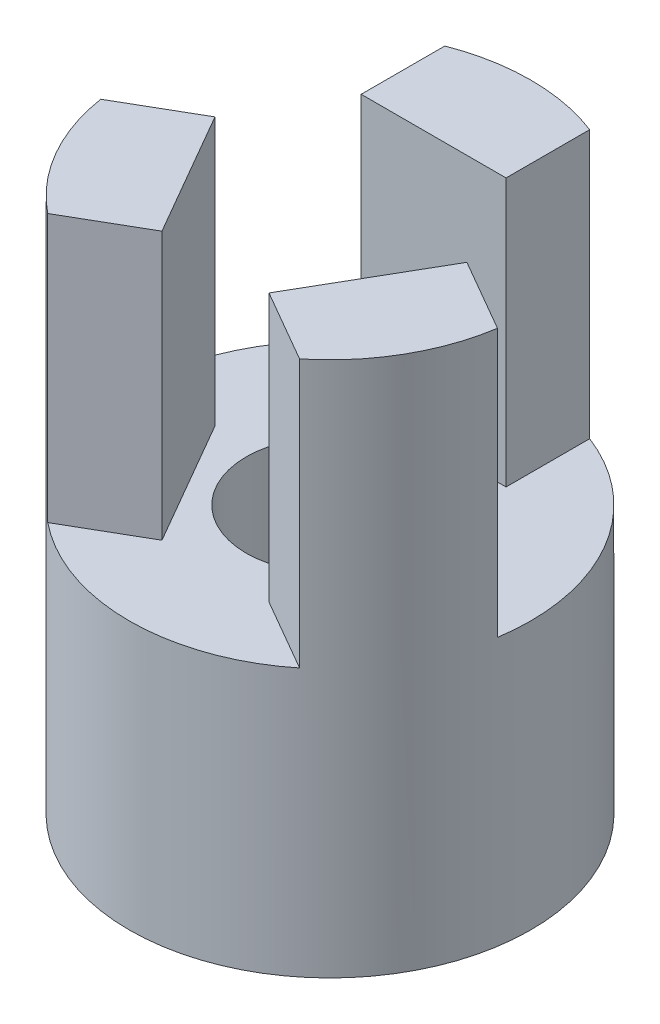
ISO-10303-21;
HEADER;
FILE_DESCRIPTION(('STEP AP214'),'2;1');
FILE_NAME('part.step','',(''),(''),'','','');
FILE_SCHEMA(('AUTOMOTIVE_DESIGN { 1 0 10303 214 1 1 1 1 }'));
ENDSEC;
DATA;
#1=APPLICATION_CONTEXT('core data for automotive mechanical design processes');
#2=APPLICATION_PROTOCOL_DEFINITION('international standard','automotive_design',2000,#1);
#3=PRODUCT_CONTEXT('',#1,'mechanical');
#4=PRODUCT('Part','Part','',(#3));
#5=PRODUCT_RELATED_PRODUCT_CATEGORY('part','',(#4));
#6=PRODUCT_DEFINITION_FORMATION('','',#4);
#7=PRODUCT_DEFINITION_CONTEXT('part definition',#1,'design');
#8=PRODUCT_DEFINITION('design','',#6,#7);
#9=PRODUCT_DEFINITION_SHAPE('','',#8);
#10=(LENGTH_UNIT() NAMED_UNIT(*) SI_UNIT(.MILLI.,.METRE.));
#11=(NAMED_UNIT(*) PLANE_ANGLE_UNIT() SI_UNIT($,.RADIAN.));
#12=(NAMED_UNIT(*) SI_UNIT($,.STERADIAN.) SOLID_ANGLE_UNIT());
#13=UNCERTAINTY_MEASURE_WITH_UNIT(LENGTH_MEASURE(1.E-05),#10,'distance_accuracy_value','');
#14=(GEOMETRIC_REPRESENTATION_CONTEXT(3) GLOBAL_UNCERTAINTY_ASSIGNED_CONTEXT((#13)) GLOBAL_UNIT_ASSIGNED_CONTEXT((#10,
#11,#12)) REPRESENTATION_CONTEXT('',''));
#15=CARTESIAN_POINT('',(0.,0.,0.));
#16=DIRECTION('',(0.,0.,1.));
#17=DIRECTION('',(1.,0.,0.));
#18=AXIS2_PLACEMENT_3D('',#15,#16,#17);
#19=CARTESIAN_POINT('',(0.,-10.16,0.));
#20=DIRECTION('',(0.,1.,0.));
#21=DIRECTION('',(0.,0.,1.));
#22=AXIS2_PLACEMENT_3D('',#19,#20,#21);
#23=CYLINDRICAL_SURFACE('',#22,3.175);
#24=CARTESIAN_POINT('',(0.,0.,0.));
#25=DIRECTION('',(0.,1.,0.));
#26=DIRECTION('',(0.,0.,1.));
#27=AXIS2_PLACEMENT_3D('',#24,#25,#26);
#28=CIRCLE('',#27,3.175);
#29=CARTESIAN_POINT('',(0.,0.,3.175));
#30=VERTEX_POINT('',#29);
#31=EDGE_CURVE('E281',#30,#30,#28,.T.);
#32=ORIENTED_EDGE('',*,*,#31,.T.);
#33=EDGE_LOOP('',(#32));
#34=FACE_BOUND('',#33,.T.);
#35=CARTESIAN_POINT('',(0.,-6.858,0.));
#36=DIRECTION('',(0.,-1.,0.));
#37=DIRECTION('',(0.,0.,-1.));
#38=AXIS2_PLACEMENT_3D('',#35,#36,#37);
#39=CIRCLE('',#38,3.175);
#40=CARTESIAN_POINT('',(0.,-6.858,-3.175));
#41=VERTEX_POINT('',#40);
#42=EDGE_CURVE('E42',#41,#41,#39,.F.);
#43=ORIENTED_EDGE('',*,*,#42,.F.);
#44=EDGE_LOOP('',(#43));
#45=FACE_BOUND('',#44,.T.);
#46=ADVANCED_FACE('F38',(#34,#45),#23,.F.);
#47=CARTESIAN_POINT('',(0.,0.,0.));
#48=DIRECTION('',(0.,1.,0.));
#49=DIRECTION('',(0.,0.,1.));
#50=AXIS2_PLACEMENT_3D('',#47,#48,#49);
#51=PLANE('',#50);
#52=ORIENTED_EDGE('',*,*,#31,.F.);
#53=EDGE_LOOP('',(#52));
#54=FACE_BOUND('',#53,.T.);
#55=CARTESIAN_POINT('',(0.,0.,0.));
#56=DIRECTION('',(0.,1.,0.));
#57=DIRECTION('',(0.,0.,1.));
#58=AXIS2_PLACEMENT_3D('',#55,#56,#57);
#59=CIRCLE('',#58,7.62);
#60=CARTESIAN_POINT('',(7.52932168056398,0.,1.17205589908897));
#61=VERTEX_POINT('',#60);
#62=CARTESIAN_POINT('',(2.74963065701567,0.,-7.10661179817778));
#63=VERTEX_POINT('',#62);
#64=EDGE_CURVE('E282',#61,#63,#59,.T.);
#65=ORIENTED_EDGE('',*,*,#64,.T.);
#66=DIRECTION('',(0.,0.,-1.));
#67=VECTOR('',#66,1.);
#68=CARTESIAN_POINT('',(2.74963065701559,0.,0.));
#69=LINE('',#68,#67);
#70=CARTESIAN_POINT('',(2.74963065701563,0.,-3.93297806229325));
#71=VERTEX_POINT('',#70);
#72=EDGE_CURVE('E62',#71,#63,#69,.T.);
#73=ORIENTED_EDGE('',*,*,#72,.F.);
#74=DIRECTION('',(-1.,0.,0.));
#75=VECTOR('',#74,1.);
#76=CARTESIAN_POINT('',(0.,0.,-3.93297806229327));
#77=LINE('',#76,#75);
#78=CARTESIAN_POINT('',(-2.74963065701558,0.,-3.9329780622933));
#79=VERTEX_POINT('',#78);
#80=EDGE_CURVE('E223',#71,#79,#77,.T.);
#81=ORIENTED_EDGE('',*,*,#80,.T.);
#82=DIRECTION('',(0.,0.,1.));
#83=VECTOR('',#82,1.);
#84=CARTESIAN_POINT('',(-2.74963065701559,0.,0.));
#85=LINE('',#84,#83);
#86=CARTESIAN_POINT('',(-2.74963065701557,0.,-7.10661179817782));
#87=VERTEX_POINT('',#86);
#88=EDGE_CURVE('E232',#87,#79,#85,.T.);
#89=ORIENTED_EDGE('',*,*,#88,.F.);
#90=CARTESIAN_POINT('',(-7.52932168056399,0.,1.17205589908886));
#91=VERTEX_POINT('',#90);
#92=EDGE_CURVE('E284',#87,#91,#59,.T.);
#93=ORIENTED_EDGE('',*,*,#92,.T.);
#94=DIRECTION('',(-0.866025403784442,0.,0.499999999999995));
#95=VECTOR('',#94,1.);
#96=CARTESIAN_POINT('',(-1.37481532850778,0.,-2.38125000000001));
#97=LINE('',#96,#95);
#98=CARTESIAN_POINT('',(-4.78087424298067,0.,-0.414760968853385));
#99=VERTEX_POINT('',#98);
#100=EDGE_CURVE('E246',#99,#91,#97,.T.);
#101=ORIENTED_EDGE('',*,*,#100,.F.);
#102=DIRECTION('',(0.499999999999998,0.,0.86602540378444));
#103=VECTOR('',#102,1.);
#104=CARTESIAN_POINT('',(-3.40605891447288,0.,1.96648903114663));
#105=LINE('',#104,#103);
#106=CARTESIAN_POINT('',(-2.03124358596508,0.,4.34773903114664));
#107=VERTEX_POINT('',#106);
#108=EDGE_CURVE('E251',#99,#107,#105,.T.);
#109=ORIENTED_EDGE('',*,*,#108,.T.);
#110=DIRECTION('',(0.866025403784438,0.,-0.500000000000001));
#111=VECTOR('',#110,1.);
#112=CARTESIAN_POINT('',(1.3748153285078,0.,2.38125));
#113=LINE('',#112,#111);
#114=CARTESIAN_POINT('',(-4.77969102354839,0.,5.93455589908891));
#115=VERTEX_POINT('',#114);
#116=EDGE_CURVE('E261',#115,#107,#113,.T.);
#117=ORIENTED_EDGE('',*,*,#116,.F.);
#118=CARTESIAN_POINT('',(4.77969102354839,0.,5.93455589908891));
#119=VERTEX_POINT('',#118);
#120=EDGE_CURVE('E276',#115,#119,#59,.T.);
#121=ORIENTED_EDGE('',*,*,#120,.T.);
#122=DIRECTION('',(0.866025403784438,0.,0.500000000000001));
#123=VECTOR('',#122,1.);
#124=CARTESIAN_POINT('',(-1.3748153285078,0.,2.38125));
#125=LINE('',#124,#123);
#126=CARTESIAN_POINT('',(2.03124358596508,0.,4.34773903114664));
#127=VERTEX_POINT('',#126);
#128=EDGE_CURVE('E280',#127,#119,#125,.T.);
#129=ORIENTED_EDGE('',*,*,#128,.F.);
#130=DIRECTION('',(0.500000000000005,0.,-0.866025403784436));
#131=VECTOR('',#130,1.);
#132=CARTESIAN_POINT('',(3.40605891447288,0.,1.96648903114667));
#133=LINE('',#132,#131);
#134=CARTESIAN_POINT('',(4.78087424298068,0.,-0.414760968853316));
#135=VERTEX_POINT('',#134);
#136=EDGE_CURVE('E291',#127,#135,#133,.T.);
#137=ORIENTED_EDGE('',*,*,#136,.T.);
#138=DIRECTION('',(-0.866025403784435,0.,-0.500000000000007));
#139=VECTOR('',#138,1.);
#140=CARTESIAN_POINT('',(1.37481532850781,0.,-2.38124999999999));
#141=LINE('',#140,#139);
#142=EDGE_CURVE('E301',#61,#135,#141,.T.);
#143=ORIENTED_EDGE('',*,*,#142,.F.);
#144=EDGE_LOOP('',(#65,#73,#81,#89,#93,#101,#109,#117,#121,#129,#137,#143));
#145=FACE_BOUND('',#144,.T.);
#146=ADVANCED_FACE('F321',(#54,#145),#51,.T.);
#147=CARTESIAN_POINT('',(-1.3748153285078,10.16,2.38125));
#148=DIRECTION('',(0.500000000000001,0.,-0.866025403784438));
#149=DIRECTION('',(-0.866025403784438,0.,-0.500000000000001));
#150=AXIS2_PLACEMENT_3D('',#147,#148,#149);
#151=PLANE('',#150);
#152=ORIENTED_EDGE('',*,*,#128,.T.);
#153=DIRECTION('',(0.,-1.,0.));
#154=VECTOR('',#153,1.);
#155=CARTESIAN_POINT('',(4.77969102354839,10.16,5.93455589908891));
#156=LINE('',#155,#154);
#157=CARTESIAN_POINT('',(4.77969102354839,10.16,5.93455589908891));
#158=VERTEX_POINT('',#157);
#159=EDGE_CURVE('E11',#158,#119,#156,.T.);
#160=ORIENTED_EDGE('',*,*,#159,.F.);
#161=DIRECTION('',(0.866025403784438,0.,0.500000000000001));
#162=VECTOR('',#161,1.);
#163=CARTESIAN_POINT('',(-1.3748153285078,10.16,2.38125));
#164=LINE('',#163,#162);
#165=CARTESIAN_POINT('',(2.03124358596508,10.16,4.34773903114664));
#166=VERTEX_POINT('',#165);
#167=EDGE_CURVE('E287',#166,#158,#164,.T.);
#168=ORIENTED_EDGE('',*,*,#167,.F.);
#169=DIRECTION('',(0.,-1.,0.));
#170=VECTOR('',#169,1.);
#171=CARTESIAN_POINT('',(2.03124358596508,10.16,4.34773903114664));
#172=LINE('',#171,#170);
#173=EDGE_CURVE('E298',#166,#127,#172,.T.);
#174=ORIENTED_EDGE('',*,*,#173,.T.);
#175=EDGE_LOOP('',(#152,#160,#168,#174));
#176=FACE_BOUND('',#175,.T.);
#177=ADVANCED_FACE('F40',(#176),#151,.F.);
#178=CARTESIAN_POINT('',(0.,10.16,0.));
#179=DIRECTION('',(0.,-1.,0.));
#180=DIRECTION('',(0.,0.,-1.));
#181=AXIS2_PLACEMENT_3D('',#178,#179,#180);
#182=CYLINDRICAL_SURFACE('',#181,7.62);
#183=ORIENTED_EDGE('',*,*,#159,.T.);
#184=ORIENTED_EDGE('',*,*,#120,.F.);
#185=DIRECTION('',(0.,-1.,0.));
#186=VECTOR('',#185,1.);
#187=CARTESIAN_POINT('',(-4.77969102354839,10.16,5.93455589908891));
#188=LINE('',#187,#186);
#189=CARTESIAN_POINT('',(-4.77969102354839,10.16,5.93455589908891));
#190=VERTEX_POINT('',#189);
#191=EDGE_CURVE('E270',#190,#115,#188,.T.);
#192=ORIENTED_EDGE('',*,*,#191,.F.);
#193=CARTESIAN_POINT('',(0.,10.16,0.));
#194=DIRECTION('',(0.,1.,0.));
#195=DIRECTION('',(0.,0.,1.));
#196=AXIS2_PLACEMENT_3D('',#193,#194,#195);
#197=CIRCLE('',#196,7.62);
#198=CARTESIAN_POINT('',(-7.52932168056399,10.16,1.17205589908886));
#199=VERTEX_POINT('',#198);
#200=EDGE_CURVE('E250',#199,#190,#197,.T.);
#201=ORIENTED_EDGE('',*,*,#200,.F.);
#202=DIRECTION('',(0.,-1.,0.));
#203=VECTOR('',#202,1.);
#204=CARTESIAN_POINT('',(-7.52932168056399,10.16,1.17205589908886));
#205=LINE('',#204,#203);
#206=EDGE_CURVE('E273',#199,#91,#205,.T.);
#207=ORIENTED_EDGE('',*,*,#206,.T.);
#208=ORIENTED_EDGE('',*,*,#92,.F.);
#209=DIRECTION('',(0.,-1.,0.));
#210=VECTOR('',#209,1.);
#211=CARTESIAN_POINT('',(-2.74963065701557,10.16,-7.10661179817782));
#212=LINE('',#211,#210);
#213=CARTESIAN_POINT('',(-2.74963065701557,10.16,-7.10661179817782));
#214=VERTEX_POINT('',#213);
#215=EDGE_CURVE('E240',#214,#87,#212,.T.);
#216=ORIENTED_EDGE('',*,*,#215,.F.);
#217=CARTESIAN_POINT('',(0.,10.16,0.));
#218=DIRECTION('',(0.,1.,0.));
#219=DIRECTION('',(0.,0.,1.));
#220=AXIS2_PLACEMENT_3D('',#217,#218,#219);
#221=CIRCLE('',#220,7.62);
#222=CARTESIAN_POINT('',(2.74963065701567,10.16,-7.10661179817778));
#223=VERTEX_POINT('',#222);
#224=EDGE_CURVE('E222',#223,#214,#221,.T.);
#225=ORIENTED_EDGE('',*,*,#224,.F.);
#226=DIRECTION('',(0.,-1.,0.));
#227=VECTOR('',#226,1.);
#228=CARTESIAN_POINT('',(2.74963065701567,10.16,-7.10661179817778));
#229=LINE('',#228,#227);
#230=EDGE_CURVE('E243',#223,#63,#229,.T.);
#231=ORIENTED_EDGE('',*,*,#230,.T.);
#232=ORIENTED_EDGE('',*,*,#64,.F.);
#233=DIRECTION('',(0.,-1.,0.));
#234=VECTOR('',#233,1.);
#235=CARTESIAN_POINT('',(7.52932168056398,10.16,1.17205589908897));
#236=LINE('',#235,#234);
#237=CARTESIAN_POINT('',(7.52932168056398,10.16,1.17205589908897));
#238=VERTEX_POINT('',#237);
#239=EDGE_CURVE('E47',#238,#61,#236,.T.);
#240=ORIENTED_EDGE('',*,*,#239,.F.);
#241=CARTESIAN_POINT('',(0.,10.16,0.));
#242=DIRECTION('',(0.,1.,0.));
#243=DIRECTION('',(0.,0.,1.));
#244=AXIS2_PLACEMENT_3D('',#241,#242,#243);
#245=CIRCLE('',#244,7.62);
#246=EDGE_CURVE('E290',#158,#238,#245,.T.);
#247=ORIENTED_EDGE('',*,*,#246,.F.);
#248=EDGE_LOOP('',(#183,#184,#192,#201,#207,#208,#216,#225,#231,#232,#240,#247));
#249=FACE_BOUND('',#248,.T.);
#250=CARTESIAN_POINT('',(0.,-10.16,0.));
#251=DIRECTION('',(0.,1.,0.));
#252=DIRECTION('',(0.,0.,1.));
#253=AXIS2_PLACEMENT_3D('',#250,#251,#252);
#254=CIRCLE('',#253,7.62);
#255=CARTESIAN_POINT('',(0.,-10.16,7.62));
#256=VERTEX_POINT('',#255);
#257=EDGE_CURVE('E277',#256,#256,#254,.T.);
#258=ORIENTED_EDGE('',*,*,#257,.T.);
#259=EDGE_LOOP('',(#258));
#260=FACE_BOUND('',#259,.T.);
#261=ADVANCED_FACE('F318',(#249,#260),#182,.T.);
#262=CARTESIAN_POINT('',(1.37481532850781,10.16,-2.38124999999999));
#263=DIRECTION('',(-0.500000000000007,0.,0.866025403784434));
#264=DIRECTION('',(0.866025403784435,0.,0.500000000000007));
#265=AXIS2_PLACEMENT_3D('',#262,#263,#264);
#266=PLANE('',#265);
#267=ORIENTED_EDGE('',*,*,#142,.T.);
#268=DIRECTION('',(0.,-1.,0.));
#269=VECTOR('',#268,1.);
#270=CARTESIAN_POINT('',(4.78087424298068,10.16,-0.414760968853316));
#271=LINE('',#270,#269);
#272=CARTESIAN_POINT('',(4.78087424298068,10.16,-0.414760968853316));
#273=VERTEX_POINT('',#272);
#274=EDGE_CURVE('E307',#273,#135,#271,.T.);
#275=ORIENTED_EDGE('',*,*,#274,.F.);
#276=DIRECTION('',(-0.866025403784435,0.,-0.500000000000007));
#277=VECTOR('',#276,1.);
#278=CARTESIAN_POINT('',(1.37481532850781,10.16,-2.38124999999999));
#279=LINE('',#278,#277);
#280=EDGE_CURVE('E293',#238,#273,#279,.T.);
#281=ORIENTED_EDGE('',*,*,#280,.F.);
#282=ORIENTED_EDGE('',*,*,#239,.T.);
#283=EDGE_LOOP('',(#267,#275,#281,#282));
#284=FACE_BOUND('',#283,.T.);
#285=ADVANCED_FACE('F314',(#284),#266,.F.);
#286=CARTESIAN_POINT('',(3.40605891447288,10.16,1.96648903114667));
#287=DIRECTION('',(-0.866025403784436,0.,-0.500000000000005));
#288=DIRECTION('',(-0.500000000000005,0.,0.866025403784436));
#289=AXIS2_PLACEMENT_3D('',#286,#287,#288);
#290=PLANE('',#289);
#291=ORIENTED_EDGE('',*,*,#136,.F.);
#292=ORIENTED_EDGE('',*,*,#173,.F.);
#293=DIRECTION('',(0.500000000000005,0.,-0.866025403784436));
#294=VECTOR('',#293,1.);
#295=CARTESIAN_POINT('',(3.40605891447288,10.16,1.96648903114667));
#296=LINE('',#295,#294);
#297=EDGE_CURVE('E295',#166,#273,#296,.T.);
#298=ORIENTED_EDGE('',*,*,#297,.T.);
#299=ORIENTED_EDGE('',*,*,#274,.T.);
#300=EDGE_LOOP('',(#291,#292,#298,#299));
#301=FACE_BOUND('',#300,.T.);
#302=ADVANCED_FACE('F324',(#301),#290,.T.);
#303=CARTESIAN_POINT('',(0.,10.16,0.));
#304=DIRECTION('',(0.,1.,0.));
#305=DIRECTION('',(0.,0.,1.));
#306=AXIS2_PLACEMENT_3D('',#303,#304,#305);
#307=PLANE('',#306);
#308=ORIENTED_EDGE('',*,*,#167,.T.);
#309=ORIENTED_EDGE('',*,*,#246,.T.);
#310=ORIENTED_EDGE('',*,*,#280,.T.);
#311=ORIENTED_EDGE('',*,*,#297,.F.);
#312=EDGE_LOOP('',(#308,#309,#310,#311));
#313=FACE_BOUND('',#312,.T.);
#314=ADVANCED_FACE('F328',(#313),#307,.T.);
#315=CARTESIAN_POINT('',(0.,-10.16,0.));
#316=DIRECTION('',(0.,1.,0.));
#317=DIRECTION('',(0.,0.,1.));
#318=AXIS2_PLACEMENT_3D('',#315,#316,#317);
#319=PLANE('',#318);
#320=DIRECTION('',(-0.5,0.,0.866025403784439));
#321=VECTOR('',#320,1.);
#322=CARTESIAN_POINT('',(6.35,-10.16,0.));
#323=LINE('',#322,#321);
#324=CARTESIAN_POINT('',(6.35,-10.16,0.));
#325=VERTEX_POINT('',#324);
#326=CARTESIAN_POINT('',(3.175,-10.16,5.49926131403119));
#327=VERTEX_POINT('',#326);
#328=EDGE_CURVE('E200',#325,#327,#323,.T.);
#329=ORIENTED_EDGE('',*,*,#328,.F.);
#330=DIRECTION('',(0.5,0.,0.866025403784439));
#331=VECTOR('',#330,1.);
#332=CARTESIAN_POINT('',(3.175,-10.16,-5.49926131403119));
#333=LINE('',#332,#331);
#334=CARTESIAN_POINT('',(3.175,-10.16,-5.49926131403119));
#335=VERTEX_POINT('',#334);
#336=EDGE_CURVE('E54',#335,#325,#333,.T.);
#337=ORIENTED_EDGE('',*,*,#336,.F.);
#338=DIRECTION('',(1.,0.,0.));
#339=VECTOR('',#338,1.);
#340=CARTESIAN_POINT('',(-3.175,-10.16,-5.49926131403119));
#341=LINE('',#340,#339);
#342=CARTESIAN_POINT('',(-3.175,-10.16,-5.49926131403119));
#343=VERTEX_POINT('',#342);
#344=EDGE_CURVE('E186',#343,#335,#341,.T.);
#345=ORIENTED_EDGE('',*,*,#344,.F.);
#346=DIRECTION('',(0.5,0.,-0.866025403784439));
#347=VECTOR('',#346,1.);
#348=CARTESIAN_POINT('',(-6.35,-10.16,0.));
#349=LINE('',#348,#347);
#350=CARTESIAN_POINT('',(-6.35,-10.16,0.));
#351=VERTEX_POINT('',#350);
#352=EDGE_CURVE('E189',#351,#343,#349,.T.);
#353=ORIENTED_EDGE('',*,*,#352,.F.);
#354=DIRECTION('',(-0.5,0.,-0.866025403784439));
#355=VECTOR('',#354,1.);
#356=CARTESIAN_POINT('',(-3.175,-10.16,5.49926131403119));
#357=LINE('',#356,#355);
#358=CARTESIAN_POINT('',(-3.175,-10.16,5.49926131403119));
#359=VERTEX_POINT('',#358);
#360=EDGE_CURVE('E205',#359,#351,#357,.T.);
#361=ORIENTED_EDGE('',*,*,#360,.F.);
#362=DIRECTION('',(-1.,0.,0.));
#363=VECTOR('',#362,1.);
#364=CARTESIAN_POINT('',(3.175,-10.16,5.49926131403119));
#365=LINE('',#364,#363);
#366=EDGE_CURVE('E202',#327,#359,#365,.T.);
#367=ORIENTED_EDGE('',*,*,#366,.F.);
#368=EDGE_LOOP('',(#329,#337,#345,#353,#361,#367));
#369=FACE_BOUND('',#368,.T.);
#370=ORIENTED_EDGE('',*,*,#257,.F.);
#371=EDGE_LOOP('',(#370));
#372=FACE_BOUND('',#371,.T.);
#373=ADVANCED_FACE('F381',(#369,#372),#319,.F.);
#374=CARTESIAN_POINT('',(-1.37481532850778,10.16,-2.38125000000001));
#375=DIRECTION('',(0.499999999999995,0.,0.866025403784442));
#376=DIRECTION('',(0.866025403784442,0.,-0.499999999999995));
#377=AXIS2_PLACEMENT_3D('',#374,#375,#376);
#378=PLANE('',#377);
#379=ORIENTED_EDGE('',*,*,#100,.T.);
#380=ORIENTED_EDGE('',*,*,#206,.F.);
#381=DIRECTION('',(-0.866025403784442,0.,0.499999999999995));
#382=VECTOR('',#381,1.);
#383=CARTESIAN_POINT('',(-1.37481532850778,10.16,-2.38125000000001));
#384=LINE('',#383,#382);
#385=CARTESIAN_POINT('',(-4.78087424298067,10.16,-0.414760968853385));
#386=VERTEX_POINT('',#385);
#387=EDGE_CURVE('E247',#386,#199,#384,.T.);
#388=ORIENTED_EDGE('',*,*,#387,.F.);
#389=DIRECTION('',(0.,-1.,0.));
#390=VECTOR('',#389,1.);
#391=CARTESIAN_POINT('',(-4.78087424298067,10.16,-0.414760968853385));
#392=LINE('',#391,#390);
#393=EDGE_CURVE('E258',#386,#99,#392,.T.);
#394=ORIENTED_EDGE('',*,*,#393,.T.);
#395=EDGE_LOOP('',(#379,#380,#388,#394));
#396=FACE_BOUND('',#395,.T.);
#397=ADVANCED_FACE('F345',(#396),#378,.F.);
#398=CARTESIAN_POINT('',(1.3748153285078,10.16,2.38125));
#399=DIRECTION('',(-0.500000000000001,0.,-0.866025403784438));
#400=DIRECTION('',(-0.866025403784438,0.,0.500000000000001));
#401=AXIS2_PLACEMENT_3D('',#398,#399,#400);
#402=PLANE('',#401);
#403=ORIENTED_EDGE('',*,*,#116,.T.);
#404=DIRECTION('',(0.,-1.,0.));
#405=VECTOR('',#404,1.);
#406=CARTESIAN_POINT('',(-2.03124358596508,10.16,4.34773903114664));
#407=LINE('',#406,#405);
#408=CARTESIAN_POINT('',(-2.03124358596508,10.16,4.34773903114664));
#409=VERTEX_POINT('',#408);
#410=EDGE_CURVE('E267',#409,#107,#407,.T.);
#411=ORIENTED_EDGE('',*,*,#410,.F.);
#412=DIRECTION('',(0.866025403784438,0.,-0.500000000000001));
#413=VECTOR('',#412,1.);
#414=CARTESIAN_POINT('',(1.3748153285078,10.16,2.38125));
#415=LINE('',#414,#413);
#416=EDGE_CURVE('E253',#190,#409,#415,.T.);
#417=ORIENTED_EDGE('',*,*,#416,.F.);
#418=ORIENTED_EDGE('',*,*,#191,.T.);
#419=EDGE_LOOP('',(#403,#411,#417,#418));
#420=FACE_BOUND('',#419,.T.);
#421=ADVANCED_FACE('F335',(#420),#402,.F.);
#422=CARTESIAN_POINT('',(-3.40605891447288,10.16,1.96648903114663));
#423=DIRECTION('',(0.86602540378444,0.,-0.499999999999998));
#424=DIRECTION('',(-0.499999999999998,0.,-0.86602540378444));
#425=AXIS2_PLACEMENT_3D('',#422,#423,#424);
#426=PLANE('',#425);
#427=ORIENTED_EDGE('',*,*,#108,.F.);
#428=ORIENTED_EDGE('',*,*,#393,.F.);
#429=DIRECTION('',(0.499999999999998,0.,0.86602540378444));
#430=VECTOR('',#429,1.);
#431=CARTESIAN_POINT('',(-3.40605891447288,10.16,1.96648903114663));
#432=LINE('',#431,#430);
#433=EDGE_CURVE('E255',#386,#409,#432,.T.);
#434=ORIENTED_EDGE('',*,*,#433,.T.);
#435=ORIENTED_EDGE('',*,*,#410,.T.);
#436=EDGE_LOOP('',(#427,#428,#434,#435));
#437=FACE_BOUND('',#436,.T.);
#438=ADVANCED_FACE('F427',(#437),#426,.T.);
#439=CARTESIAN_POINT('',(0.,10.16,0.));
#440=DIRECTION('',(0.,1.,0.));
#441=DIRECTION('',(0.,0.,1.));
#442=AXIS2_PLACEMENT_3D('',#439,#440,#441);
#443=PLANE('',#442);
#444=ORIENTED_EDGE('',*,*,#387,.T.);
#445=ORIENTED_EDGE('',*,*,#200,.T.);
#446=ORIENTED_EDGE('',*,*,#416,.T.);
#447=ORIENTED_EDGE('',*,*,#433,.F.);
#448=EDGE_LOOP('',(#444,#445,#446,#447));
#449=FACE_BOUND('',#448,.T.);
#450=ADVANCED_FACE('F339',(#449),#443,.T.);
#451=CARTESIAN_POINT('',(2.74963065701559,10.16,0.));
#452=DIRECTION('',(-1.,0.,0.));
#453=DIRECTION('',(0.,0.,1.));
#454=AXIS2_PLACEMENT_3D('',#451,#452,#453);
#455=PLANE('',#454);
#456=ORIENTED_EDGE('',*,*,#72,.T.);
#457=ORIENTED_EDGE('',*,*,#230,.F.);
#458=DIRECTION('',(0.,0.,-1.));
#459=VECTOR('',#458,1.);
#460=CARTESIAN_POINT('',(2.74963065701559,10.16,0.));
#461=LINE('',#460,#459);
#462=CARTESIAN_POINT('',(2.74963065701563,10.16,-3.93297806229325));
#463=VERTEX_POINT('',#462);
#464=EDGE_CURVE('E219',#463,#223,#461,.T.);
#465=ORIENTED_EDGE('',*,*,#464,.F.);
#466=DIRECTION('',(0.,-1.,0.));
#467=VECTOR('',#466,1.);
#468=CARTESIAN_POINT('',(2.74963065701563,10.16,-3.93297806229325));
#469=LINE('',#468,#467);
#470=EDGE_CURVE('E230',#463,#71,#469,.T.);
#471=ORIENTED_EDGE('',*,*,#470,.T.);
#472=EDGE_LOOP('',(#456,#457,#465,#471));
#473=FACE_BOUND('',#472,.T.);
#474=ADVANCED_FACE('F357',(#473),#455,.F.);
#475=CARTESIAN_POINT('',(-2.74963065701559,10.16,0.));
#476=DIRECTION('',(1.,0.,0.));
#477=DIRECTION('',(0.,0.,-1.));
#478=AXIS2_PLACEMENT_3D('',#475,#476,#477);
#479=PLANE('',#478);
#480=ORIENTED_EDGE('',*,*,#88,.T.);
#481=DIRECTION('',(0.,-1.,0.));
#482=VECTOR('',#481,1.);
#483=CARTESIAN_POINT('',(-2.74963065701558,10.16,-3.93297806229329));
#484=LINE('',#483,#482);
#485=CARTESIAN_POINT('',(-2.74963065701558,10.16,-3.93297806229329));
#486=VERTEX_POINT('',#485);
#487=EDGE_CURVE('E237',#486,#79,#484,.T.);
#488=ORIENTED_EDGE('',*,*,#487,.F.);
#489=DIRECTION('',(0.,0.,1.));
#490=VECTOR('',#489,1.);
#491=CARTESIAN_POINT('',(-2.74963065701559,10.16,0.));
#492=LINE('',#491,#490);
#493=EDGE_CURVE('E225',#214,#486,#492,.T.);
#494=ORIENTED_EDGE('',*,*,#493,.F.);
#495=ORIENTED_EDGE('',*,*,#215,.T.);
#496=EDGE_LOOP('',(#480,#488,#494,#495));
#497=FACE_BOUND('',#496,.T.);
#498=ADVANCED_FACE('F351',(#497),#479,.F.);
#499=CARTESIAN_POINT('',(0.,10.16,-3.93297806229327));
#500=DIRECTION('',(0.,0.,1.));
#501=DIRECTION('',(1.,0.,0.));
#502=AXIS2_PLACEMENT_3D('',#499,#500,#501);
#503=PLANE('',#502);
#504=ORIENTED_EDGE('',*,*,#80,.F.);
#505=ORIENTED_EDGE('',*,*,#470,.F.);
#506=DIRECTION('',(-1.,0.,0.));
#507=VECTOR('',#506,1.);
#508=CARTESIAN_POINT('',(0.,10.16,-3.93297806229327));
#509=LINE('',#508,#507);
#510=EDGE_CURVE('E227',#463,#486,#509,.T.);
#511=ORIENTED_EDGE('',*,*,#510,.T.);
#512=ORIENTED_EDGE('',*,*,#487,.T.);
#513=EDGE_LOOP('',(#504,#505,#511,#512));
#514=FACE_BOUND('',#513,.T.);
#515=ADVANCED_FACE('F359',(#514),#503,.T.);
#516=CARTESIAN_POINT('',(0.,10.16,0.));
#517=DIRECTION('',(0.,1.,0.));
#518=DIRECTION('',(0.,0.,1.));
#519=AXIS2_PLACEMENT_3D('',#516,#517,#518);
#520=PLANE('',#519);
#521=ORIENTED_EDGE('',*,*,#464,.T.);
#522=ORIENTED_EDGE('',*,*,#224,.T.);
#523=ORIENTED_EDGE('',*,*,#493,.T.);
#524=ORIENTED_EDGE('',*,*,#510,.F.);
#525=EDGE_LOOP('',(#521,#522,#523,#524));
#526=FACE_BOUND('',#525,.T.);
#527=ADVANCED_FACE('F355',(#526),#520,.T.);
#528=CARTESIAN_POINT('',(0.,-6.858,0.));
#529=DIRECTION('',(0.,-1.,0.));
#530=DIRECTION('',(0.,0.,-1.));
#531=AXIS2_PLACEMENT_3D('',#528,#529,#530);
#532=PLANE('',#531);
#533=DIRECTION('',(0.5,0.,0.866025403784439));
#534=VECTOR('',#533,1.);
#535=CARTESIAN_POINT('',(3.175,-6.858,-5.49926131403119));
#536=LINE('',#535,#534);
#537=CARTESIAN_POINT('',(3.175,-6.858,-5.49926131403119));
#538=VERTEX_POINT('',#537);
#539=CARTESIAN_POINT('',(6.35,-6.858,0.));
#540=VERTEX_POINT('',#539);
#541=EDGE_CURVE('E166',#538,#540,#536,.T.);
#542=ORIENTED_EDGE('',*,*,#541,.T.);
#543=DIRECTION('',(-0.5,0.,0.866025403784439));
#544=VECTOR('',#543,1.);
#545=CARTESIAN_POINT('',(6.35,-6.858,0.));
#546=LINE('',#545,#544);
#547=CARTESIAN_POINT('',(3.175,-6.858,5.49926131403119));
#548=VERTEX_POINT('',#547);
#549=EDGE_CURVE('E175',#540,#548,#546,.T.);
#550=ORIENTED_EDGE('',*,*,#549,.T.);
#551=DIRECTION('',(-1.,0.,0.));
#552=VECTOR('',#551,1.);
#553=CARTESIAN_POINT('',(3.175,-6.858,5.49926131403119));
#554=LINE('',#553,#552);
#555=CARTESIAN_POINT('',(-3.175,-6.858,5.49926131403119));
#556=VERTEX_POINT('',#555);
#557=EDGE_CURVE('E180',#548,#556,#554,.T.);
#558=ORIENTED_EDGE('',*,*,#557,.T.);
#559=DIRECTION('',(-0.5,0.,-0.866025403784439));
#560=VECTOR('',#559,1.);
#561=CARTESIAN_POINT('',(-3.175,-6.858,5.49926131403119));
#562=LINE('',#561,#560);
#563=CARTESIAN_POINT('',(-6.35,-6.858,0.));
#564=VERTEX_POINT('',#563);
#565=EDGE_CURVE('E193',#556,#564,#562,.T.);
#566=ORIENTED_EDGE('',*,*,#565,.T.);
#567=DIRECTION('',(0.5,0.,-0.866025403784439));
#568=VECTOR('',#567,1.);
#569=CARTESIAN_POINT('',(-6.35,-6.858,0.));
#570=LINE('',#569,#568);
#571=CARTESIAN_POINT('',(-3.175,-6.858,-5.49926131403119));
#572=VERTEX_POINT('',#571);
#573=EDGE_CURVE('E196',#564,#572,#570,.T.);
#574=ORIENTED_EDGE('',*,*,#573,.T.);
#575=DIRECTION('',(1.,0.,0.));
#576=VECTOR('',#575,1.);
#577=CARTESIAN_POINT('',(-3.175,-6.858,-5.49926131403119));
#578=LINE('',#577,#576);
#579=EDGE_CURVE('E172',#572,#538,#578,.T.);
#580=ORIENTED_EDGE('',*,*,#579,.T.);
#581=EDGE_LOOP('',(#542,#550,#558,#566,#574,#580));
#582=FACE_BOUND('',#581,.T.);
#583=ORIENTED_EDGE('',*,*,#42,.T.);
#584=EDGE_LOOP('',(#583));
#585=FACE_BOUND('',#584,.T.);
#586=ADVANCED_FACE('F182',(#582,#585),#532,.T.);
#587=CARTESIAN_POINT('',(3.175,-6.858,-5.49926131403119));
#588=DIRECTION('',(0.866025403784439,0.,-0.5));
#589=DIRECTION('',(-0.5,0.,-0.866025403784439));
#590=AXIS2_PLACEMENT_3D('',#587,#588,#589);
#591=PLANE('',#590);
#592=ORIENTED_EDGE('',*,*,#336,.T.);
#593=DIRECTION('',(0.,-1.,0.));
#594=VECTOR('',#593,1.);
#595=CARTESIAN_POINT('',(6.35,-6.858,0.));
#596=LINE('',#595,#594);
#597=EDGE_CURVE('E162',#540,#325,#596,.T.);
#598=ORIENTED_EDGE('',*,*,#597,.F.);
#599=ORIENTED_EDGE('',*,*,#541,.F.);
#600=DIRECTION('',(0.,-1.,0.));
#601=VECTOR('',#600,1.);
#602=CARTESIAN_POINT('',(3.175,-6.858,-5.49926131403119));
#603=LINE('',#602,#601);
#604=EDGE_CURVE('E210',#538,#335,#603,.T.);
#605=ORIENTED_EDGE('',*,*,#604,.T.);
#606=EDGE_LOOP('',(#592,#598,#599,#605));
#607=FACE_BOUND('',#606,.T.);
#608=ADVANCED_FACE('F164',(#607),#591,.F.);
#609=CARTESIAN_POINT('',(-3.175,-6.858,-5.49926131403119));
#610=DIRECTION('',(0.,0.,-1.));
#611=DIRECTION('',(-1.,0.,0.));
#612=AXIS2_PLACEMENT_3D('',#609,#610,#611);
#613=PLANE('',#612);
#614=ORIENTED_EDGE('',*,*,#344,.T.);
#615=ORIENTED_EDGE('',*,*,#604,.F.);
#616=ORIENTED_EDGE('',*,*,#579,.F.);
#617=DIRECTION('',(0.,-1.,0.));
#618=VECTOR('',#617,1.);
#619=CARTESIAN_POINT('',(-3.175,-6.858,-5.49926131403119));
#620=LINE('',#619,#618);
#621=EDGE_CURVE('E212',#572,#343,#620,.T.);
#622=ORIENTED_EDGE('',*,*,#621,.T.);
#623=EDGE_LOOP('',(#614,#615,#616,#622));
#624=FACE_BOUND('',#623,.T.);
#625=ADVANCED_FACE('F485',(#624),#613,.F.);
#626=CARTESIAN_POINT('',(-6.35,-6.858,0.));
#627=DIRECTION('',(-0.866025403784439,0.,-0.5));
#628=DIRECTION('',(-0.5,0.,0.866025403784439));
#629=AXIS2_PLACEMENT_3D('',#626,#627,#628);
#630=PLANE('',#629);
#631=ORIENTED_EDGE('',*,*,#352,.T.);
#632=ORIENTED_EDGE('',*,*,#621,.F.);
#633=ORIENTED_EDGE('',*,*,#573,.F.);
#634=DIRECTION('',(0.,-1.,0.));
#635=VECTOR('',#634,1.);
#636=CARTESIAN_POINT('',(-6.35,-6.858,0.));
#637=LINE('',#636,#635);
#638=EDGE_CURVE('E214',#564,#351,#637,.T.);
#639=ORIENTED_EDGE('',*,*,#638,.T.);
#640=EDGE_LOOP('',(#631,#632,#633,#639));
#641=FACE_BOUND('',#640,.T.);
#642=ADVANCED_FACE('F493',(#641),#630,.F.);
#643=CARTESIAN_POINT('',(-3.175,-6.858,5.49926131403119));
#644=DIRECTION('',(-0.866025403784439,0.,0.5));
#645=DIRECTION('',(0.5,0.,0.866025403784439));
#646=AXIS2_PLACEMENT_3D('',#643,#644,#645);
#647=PLANE('',#646);
#648=ORIENTED_EDGE('',*,*,#360,.T.);
#649=ORIENTED_EDGE('',*,*,#638,.F.);
#650=ORIENTED_EDGE('',*,*,#565,.F.);
#651=DIRECTION('',(0.,-1.,0.));
#652=VECTOR('',#651,1.);
#653=CARTESIAN_POINT('',(-3.175,-6.858,5.49926131403119));
#654=LINE('',#653,#652);
#655=EDGE_CURVE('E216',#556,#359,#654,.T.);
#656=ORIENTED_EDGE('',*,*,#655,.T.);
#657=EDGE_LOOP('',(#648,#649,#650,#656));
#658=FACE_BOUND('',#657,.T.);
#659=ADVANCED_FACE('F502',(#658),#647,.F.);
#660=CARTESIAN_POINT('',(3.175,-6.858,5.49926131403119));
#661=DIRECTION('',(0.,0.,1.));
#662=DIRECTION('',(1.,0.,0.));
#663=AXIS2_PLACEMENT_3D('',#660,#661,#662);
#664=PLANE('',#663);
#665=ORIENTED_EDGE('',*,*,#366,.T.);
#666=ORIENTED_EDGE('',*,*,#655,.F.);
#667=ORIENTED_EDGE('',*,*,#557,.F.);
#668=DIRECTION('',(0.,-1.,0.));
#669=VECTOR('',#668,1.);
#670=CARTESIAN_POINT('',(3.175,-6.858,5.49926131403119));
#671=LINE('',#670,#669);
#672=EDGE_CURVE('E171',#548,#327,#671,.T.);
#673=ORIENTED_EDGE('',*,*,#672,.T.);
#674=EDGE_LOOP('',(#665,#666,#667,#673));
#675=FACE_BOUND('',#674,.T.);
#676=ADVANCED_FACE('F511',(#675),#664,.F.);
#677=CARTESIAN_POINT('',(6.35,-6.858,0.));
#678=DIRECTION('',(0.866025403784439,0.,0.5));
#679=DIRECTION('',(0.5,0.,-0.866025403784439));
#680=AXIS2_PLACEMENT_3D('',#677,#678,#679);
#681=PLANE('',#680);
#682=ORIENTED_EDGE('',*,*,#328,.T.);
#683=ORIENTED_EDGE('',*,*,#672,.F.);
#684=ORIENTED_EDGE('',*,*,#549,.F.);
#685=ORIENTED_EDGE('',*,*,#597,.T.);
#686=EDGE_LOOP('',(#682,#683,#684,#685));
#687=FACE_BOUND('',#686,.T.);
#688=ADVANCED_FACE('F176',(#687),#681,.F.);
#689=CLOSED_SHELL('',(#46,#146,#177,#261,#285,#302,#314,#373,#397,#421,#438,#450,#474,#498,#515,
#527,#586,#608,#625,#642,#659,#676,#688));
#690=MANIFOLD_SOLID_BREP('B2',#689);
#691=ADVANCED_BREP_SHAPE_REPRESENTATION('',(#18,#690),#14);
#692=SHAPE_DEFINITION_REPRESENTATION(#9,#691);
ENDSEC;
END-ISO-10303-21;
